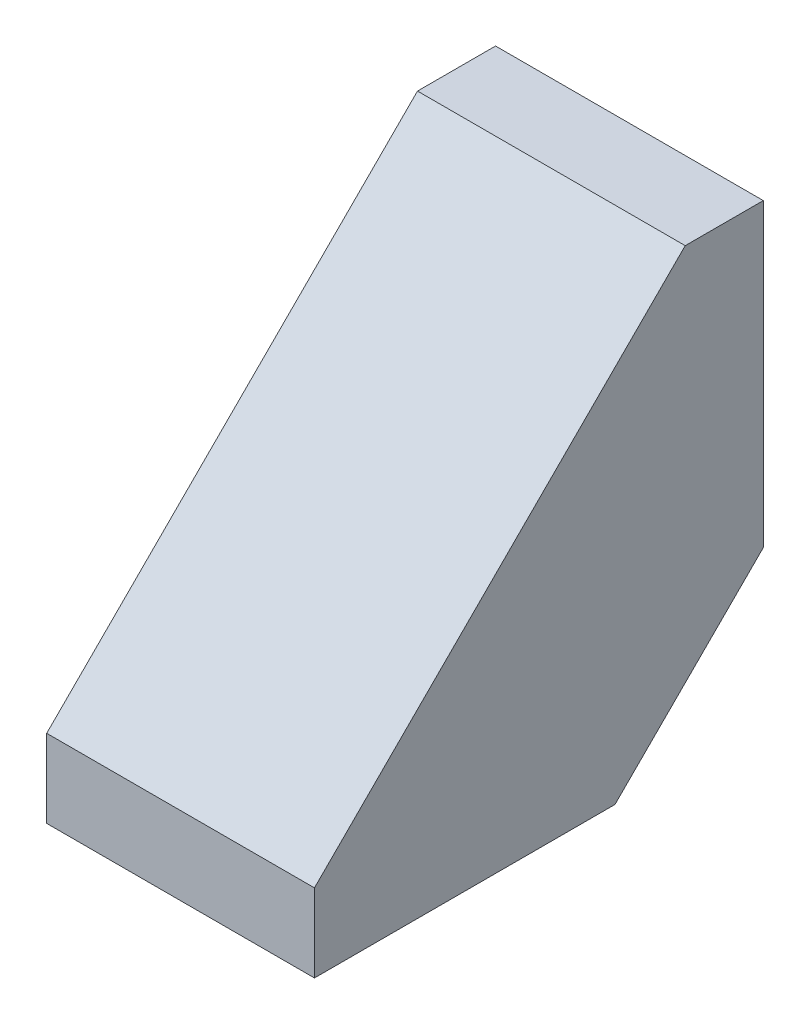
ISO-10303-21;
HEADER;
FILE_DESCRIPTION(('STEP AP214'),'2;1');
FILE_NAME('part.step','',(''),(''),'','','');
FILE_SCHEMA(('AUTOMOTIVE_DESIGN { 1 0 10303 214 1 1 1 1 }'));
ENDSEC;
DATA;
#1=APPLICATION_CONTEXT('core data for automotive mechanical design processes');
#2=APPLICATION_PROTOCOL_DEFINITION('international standard','automotive_design',2000,#1);
#3=PRODUCT_CONTEXT('',#1,'mechanical');
#4=PRODUCT('Part','Part','',(#3));
#5=PRODUCT_RELATED_PRODUCT_CATEGORY('part','',(#4));
#6=PRODUCT_DEFINITION_FORMATION('','',#4);
#7=PRODUCT_DEFINITION_CONTEXT('part definition',#1,'design');
#8=PRODUCT_DEFINITION('design','',#6,#7);
#9=PRODUCT_DEFINITION_SHAPE('','',#8);
#10=(LENGTH_UNIT() NAMED_UNIT(*) SI_UNIT(.MILLI.,.METRE.));
#11=(NAMED_UNIT(*) PLANE_ANGLE_UNIT() SI_UNIT($,.RADIAN.));
#12=(NAMED_UNIT(*) SI_UNIT($,.STERADIAN.) SOLID_ANGLE_UNIT());
#13=UNCERTAINTY_MEASURE_WITH_UNIT(LENGTH_MEASURE(1.E-05),#10,'distance_accuracy_value','');
#14=(GEOMETRIC_REPRESENTATION_CONTEXT(3) GLOBAL_UNCERTAINTY_ASSIGNED_CONTEXT((#13)) GLOBAL_UNIT_ASSIGNED_CONTEXT((#10,
#11,#12)) REPRESENTATION_CONTEXT('',''));
#15=CARTESIAN_POINT('',(0.,0.,0.));
#16=DIRECTION('',(0.,0.,1.));
#17=DIRECTION('',(1.,0.,0.));
#18=AXIS2_PLACEMENT_3D('',#15,#16,#17);
#19=CARTESIAN_POINT('',(34.3,10.,0.));
#20=DIRECTION('',(0.,0.,-1.));
#21=DIRECTION('',(0.,1.,0.));
#22=AXIS2_PLACEMENT_3D('',#19,#20,#21);
#23=PLANE('',#22);
#24=DIRECTION('',(0.,-1.,0.));
#25=VECTOR('',#24,1.);
#26=CARTESIAN_POINT('',(0.,10.,0.));
#27=LINE('',#26,#25);
#28=CARTESIAN_POINT('',(0.,10.,0.));
#29=VERTEX_POINT('',#28);
#30=CARTESIAN_POINT('',(0.,0.,0.));
#31=VERTEX_POINT('',#30);
#32=EDGE_CURVE('E118',#29,#31,#27,.T.);
#33=ORIENTED_EDGE('',*,*,#32,.T.);
#34=DIRECTION('',(-1.,0.,0.));
#35=VECTOR('',#34,1.);
#36=CARTESIAN_POINT('',(34.3,0.,0.));
#37=LINE('',#36,#35);
#38=CARTESIAN_POINT('',(34.3,0.,0.));
#39=VERTEX_POINT('',#38);
#40=EDGE_CURVE('E11',#39,#31,#37,.T.);
#41=ORIENTED_EDGE('',*,*,#40,.F.);
#42=DIRECTION('',(0.,-1.,0.));
#43=VECTOR('',#42,1.);
#44=CARTESIAN_POINT('',(34.3,10.,0.));
#45=LINE('',#44,#43);
#46=CARTESIAN_POINT('',(34.3,10.,0.));
#47=VERTEX_POINT('',#46);
#48=EDGE_CURVE('E128',#47,#39,#45,.T.);
#49=ORIENTED_EDGE('',*,*,#48,.F.);
#50=DIRECTION('',(-1.,0.,0.));
#51=VECTOR('',#50,1.);
#52=CARTESIAN_POINT('',(34.3,10.,0.));
#53=LINE('',#52,#51);
#54=EDGE_CURVE('E114',#47,#29,#53,.T.);
#55=ORIENTED_EDGE('',*,*,#54,.T.);
#56=EDGE_LOOP('',(#33,#41,#49,#55));
#57=FACE_BOUND('',#56,.T.);
#58=ADVANCED_FACE('F34',(#57),#23,.F.);
#59=CARTESIAN_POINT('',(34.3,0.,0.));
#60=DIRECTION('',(0.,1.,0.));
#61=DIRECTION('',(0.,0.,1.));
#62=AXIS2_PLACEMENT_3D('',#59,#60,#61);
#63=PLANE('',#62);
#64=DIRECTION('',(0.,0.,-1.));
#65=VECTOR('',#64,1.);
#66=CARTESIAN_POINT('',(0.,0.,0.));
#67=LINE('',#66,#65);
#68=CARTESIAN_POINT('',(0.,0.,-38.5));
#69=VERTEX_POINT('',#68);
#70=EDGE_CURVE('E121',#31,#69,#67,.T.);
#71=ORIENTED_EDGE('',*,*,#70,.T.);
#72=DIRECTION('',(-1.,0.,0.));
#73=VECTOR('',#72,1.);
#74=CARTESIAN_POINT('',(34.3,0.,-38.5));
#75=LINE('',#74,#73);
#76=CARTESIAN_POINT('',(34.3,0.,-38.5));
#77=VERTEX_POINT('',#76);
#78=EDGE_CURVE('E42',#77,#69,#75,.T.);
#79=ORIENTED_EDGE('',*,*,#78,.F.);
#80=DIRECTION('',(0.,0.,-1.));
#81=VECTOR('',#80,1.);
#82=CARTESIAN_POINT('',(34.3,0.,0.));
#83=LINE('',#82,#81);
#84=EDGE_CURVE('E87',#39,#77,#83,.T.);
#85=ORIENTED_EDGE('',*,*,#84,.F.);
#86=ORIENTED_EDGE('',*,*,#40,.T.);
#87=EDGE_LOOP('',(#71,#79,#85,#86));
#88=FACE_BOUND('',#87,.T.);
#89=ADVANCED_FACE('F152',(#88),#63,.F.);
#90=CARTESIAN_POINT('',(34.3,0.,-38.5));
#91=DIRECTION('',(0.,0.707106781186546,0.707106781186549));
#92=DIRECTION('',(0.,-0.707106781186549,0.707106781186546));
#93=AXIS2_PLACEMENT_3D('',#90,#91,#92);
#94=PLANE('',#93);
#95=DIRECTION('',(0.,0.707106781186549,-0.707106781186546));
#96=VECTOR('',#95,1.);
#97=CARTESIAN_POINT('',(0.,0.,-38.5));
#98=LINE('',#97,#96);
#99=CARTESIAN_POINT('',(0.,19.,-57.4999999999999));
#100=VERTEX_POINT('',#99);
#101=EDGE_CURVE('E123',#69,#100,#98,.T.);
#102=ORIENTED_EDGE('',*,*,#101,.T.);
#103=DIRECTION('',(-1.,0.,0.));
#104=VECTOR('',#103,1.);
#105=CARTESIAN_POINT('',(34.3,19.,-57.4999999999999));
#106=LINE('',#105,#104);
#107=CARTESIAN_POINT('',(34.3,19.,-57.4999999999999));
#108=VERTEX_POINT('',#107);
#109=EDGE_CURVE('E109',#108,#100,#106,.T.);
#110=ORIENTED_EDGE('',*,*,#109,.F.);
#111=DIRECTION('',(0.,0.707106781186549,-0.707106781186546));
#112=VECTOR('',#111,1.);
#113=CARTESIAN_POINT('',(34.3,0.,-38.5));
#114=LINE('',#113,#112);
#115=EDGE_CURVE('E100',#77,#108,#114,.T.);
#116=ORIENTED_EDGE('',*,*,#115,.F.);
#117=ORIENTED_EDGE('',*,*,#78,.T.);
#118=EDGE_LOOP('',(#102,#110,#116,#117));
#119=FACE_BOUND('',#118,.T.);
#120=ADVANCED_FACE('F134',(#119),#94,.F.);
#121=CARTESIAN_POINT('',(34.3,19.,-57.4999999999999));
#122=DIRECTION('',(0.,0.,1.));
#123=DIRECTION('',(1.,0.,0.));
#124=AXIS2_PLACEMENT_3D('',#121,#122,#123);
#125=PLANE('',#124);
#126=DIRECTION('',(0.,1.,0.));
#127=VECTOR('',#126,1.);
#128=CARTESIAN_POINT('',(0.,19.,-57.4999999999999));
#129=LINE('',#128,#127);
#130=CARTESIAN_POINT('',(0.,57.5,-57.4999999999999));
#131=VERTEX_POINT('',#130);
#132=EDGE_CURVE('E108',#100,#131,#129,.T.);
#133=ORIENTED_EDGE('',*,*,#132,.T.);
#134=DIRECTION('',(-1.,0.,0.));
#135=VECTOR('',#134,1.);
#136=CARTESIAN_POINT('',(34.3,57.5,-57.4999999999999));
#137=LINE('',#136,#135);
#138=CARTESIAN_POINT('',(34.3,57.5,-57.4999999999999));
#139=VERTEX_POINT('',#138);
#140=EDGE_CURVE('E105',#139,#131,#137,.T.);
#141=ORIENTED_EDGE('',*,*,#140,.F.);
#142=DIRECTION('',(0.,1.,0.));
#143=VECTOR('',#142,1.);
#144=CARTESIAN_POINT('',(34.3,19.,-57.4999999999999));
#145=LINE('',#144,#143);
#146=EDGE_CURVE('E94',#108,#139,#145,.T.);
#147=ORIENTED_EDGE('',*,*,#146,.F.);
#148=ORIENTED_EDGE('',*,*,#109,.T.);
#149=EDGE_LOOP('',(#133,#141,#147,#148));
#150=FACE_BOUND('',#149,.T.);
#151=ADVANCED_FACE('F106',(#150),#125,.F.);
#152=CARTESIAN_POINT('',(34.3,57.5,-57.4999999999999));
#153=DIRECTION('',(0.,-1.,0.));
#154=DIRECTION('',(0.,0.,-1.));
#155=AXIS2_PLACEMENT_3D('',#152,#153,#154);
#156=PLANE('',#155);
#157=DIRECTION('',(0.,0.,1.));
#158=VECTOR('',#157,1.);
#159=CARTESIAN_POINT('',(0.,57.5,-57.4999999999999));
#160=LINE('',#159,#158);
#161=CARTESIAN_POINT('',(0.,57.5,-47.4999999999998));
#162=VERTEX_POINT('',#161);
#163=EDGE_CURVE('E73',#131,#162,#160,.T.);
#164=ORIENTED_EDGE('',*,*,#163,.T.);
#165=DIRECTION('',(-1.,0.,0.));
#166=VECTOR('',#165,1.);
#167=CARTESIAN_POINT('',(34.3,57.5,-47.4999999999998));
#168=LINE('',#167,#166);
#169=CARTESIAN_POINT('',(34.3,57.5,-47.4999999999998));
#170=VERTEX_POINT('',#169);
#171=EDGE_CURVE('E110',#170,#162,#168,.T.);
#172=ORIENTED_EDGE('',*,*,#171,.F.);
#173=DIRECTION('',(0.,0.,1.));
#174=VECTOR('',#173,1.);
#175=CARTESIAN_POINT('',(34.3,57.5,-57.4999999999999));
#176=LINE('',#175,#174);
#177=EDGE_CURVE('E98',#139,#170,#176,.T.);
#178=ORIENTED_EDGE('',*,*,#177,.F.);
#179=ORIENTED_EDGE('',*,*,#140,.T.);
#180=EDGE_LOOP('',(#164,#172,#178,#179));
#181=FACE_BOUND('',#180,.T.);
#182=ADVANCED_FACE('F112',(#181),#156,.F.);
#183=CARTESIAN_POINT('',(34.3,57.5,-47.4999999999998));
#184=DIRECTION('',(0.,-0.707106781186546,-0.707106781186549));
#185=DIRECTION('',(0.,0.707106781186549,-0.707106781186546));
#186=AXIS2_PLACEMENT_3D('',#183,#184,#185);
#187=PLANE('',#186);
#188=DIRECTION('',(0.,-0.707106781186549,0.707106781186546));
#189=VECTOR('',#188,1.);
#190=CARTESIAN_POINT('',(0.,57.5,-47.4999999999998));
#191=LINE('',#190,#189);
#192=EDGE_CURVE('E79',#162,#29,#191,.T.);
#193=ORIENTED_EDGE('',*,*,#192,.T.);
#194=ORIENTED_EDGE('',*,*,#54,.F.);
#195=DIRECTION('',(0.,-0.707106781186549,0.707106781186546));
#196=VECTOR('',#195,1.);
#197=CARTESIAN_POINT('',(34.3,57.5,-47.4999999999998));
#198=LINE('',#197,#196);
#199=EDGE_CURVE('E50',#170,#47,#198,.T.);
#200=ORIENTED_EDGE('',*,*,#199,.F.);
#201=ORIENTED_EDGE('',*,*,#171,.T.);
#202=EDGE_LOOP('',(#193,#194,#200,#201));
#203=FACE_BOUND('',#202,.T.);
#204=ADVANCED_FACE('F141',(#203),#187,.F.);
#205=CARTESIAN_POINT('',(34.3,0.,0.));
#206=DIRECTION('',(1.,0.,0.));
#207=DIRECTION('',(0.,0.,-1.));
#208=AXIS2_PLACEMENT_3D('',#205,#206,#207);
#209=PLANE('',#208);
#210=ORIENTED_EDGE('',*,*,#48,.T.);
#211=ORIENTED_EDGE('',*,*,#84,.T.);
#212=ORIENTED_EDGE('',*,*,#115,.T.);
#213=ORIENTED_EDGE('',*,*,#146,.T.);
#214=ORIENTED_EDGE('',*,*,#177,.T.);
#215=ORIENTED_EDGE('',*,*,#199,.T.);
#216=EDGE_LOOP('',(#210,#211,#212,#213,#214,#215));
#217=FACE_BOUND('',#216,.T.);
#218=ADVANCED_FACE('F96',(#217),#209,.T.);
#219=CARTESIAN_POINT('',(0.,0.,0.));
#220=DIRECTION('',(1.,0.,0.));
#221=DIRECTION('',(0.,0.,-1.));
#222=AXIS2_PLACEMENT_3D('',#219,#220,#221);
#223=PLANE('',#222);
#224=ORIENTED_EDGE('',*,*,#32,.F.);
#225=ORIENTED_EDGE('',*,*,#192,.F.);
#226=ORIENTED_EDGE('',*,*,#163,.F.);
#227=ORIENTED_EDGE('',*,*,#132,.F.);
#228=ORIENTED_EDGE('',*,*,#101,.F.);
#229=ORIENTED_EDGE('',*,*,#70,.F.);
#230=EDGE_LOOP('',(#224,#225,#226,#227,#228,#229));
#231=FACE_BOUND('',#230,.T.);
#232=ADVANCED_FACE('F137',(#231),#223,.F.);
#233=CLOSED_SHELL('',(#58,#89,#120,#151,#182,#204,#218,#232));
#234=MANIFOLD_SOLID_BREP('B2',#233);
#235=ADVANCED_BREP_SHAPE_REPRESENTATION('',(#18,#234),#14);
#236=SHAPE_DEFINITION_REPRESENTATION(#9,#235);
ENDSEC;
END-ISO-10303-21;
